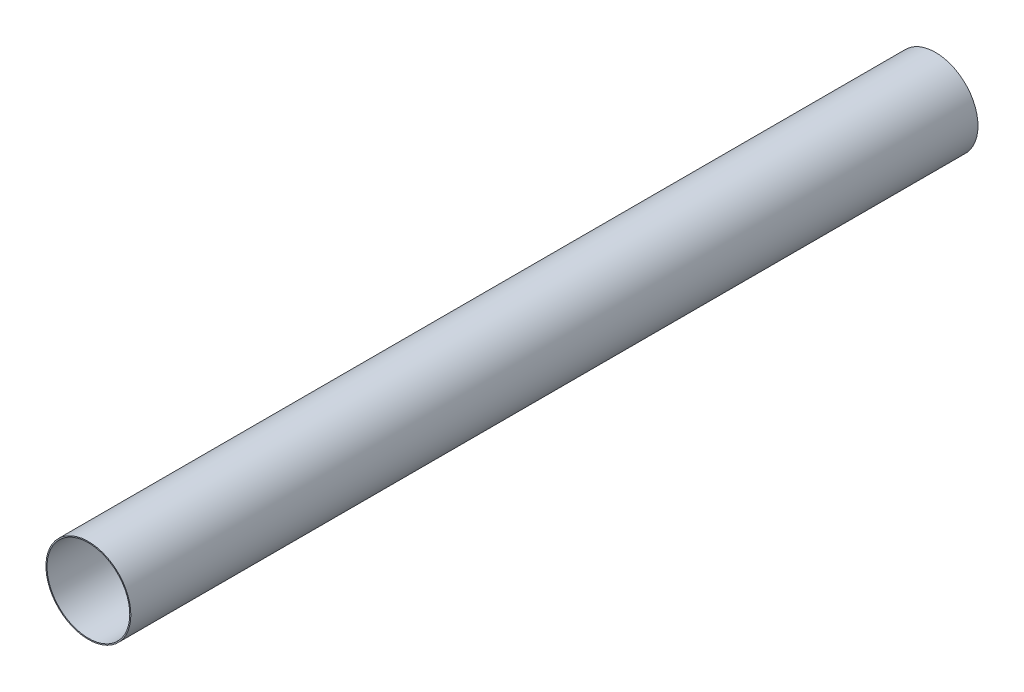
ISO-10303-21;
HEADER;
FILE_DESCRIPTION(('STEP AP214'),'2;1');
FILE_NAME('part.step','',(''),(''),'','','');
FILE_SCHEMA(('AUTOMOTIVE_DESIGN { 1 0 10303 214 1 1 1 1 }'));
ENDSEC;
DATA;
#1=APPLICATION_CONTEXT('core data for automotive mechanical design processes');
#2=APPLICATION_PROTOCOL_DEFINITION('international standard','automotive_design',2000,#1);
#3=PRODUCT_CONTEXT('',#1,'mechanical');
#4=PRODUCT('Part','Part','',(#3));
#5=PRODUCT_RELATED_PRODUCT_CATEGORY('part','',(#4));
#6=PRODUCT_DEFINITION_FORMATION('','',#4);
#7=PRODUCT_DEFINITION_CONTEXT('part definition',#1,'design');
#8=PRODUCT_DEFINITION('design','',#6,#7);
#9=PRODUCT_DEFINITION_SHAPE('','',#8);
#10=(LENGTH_UNIT() NAMED_UNIT(*) SI_UNIT(.MILLI.,.METRE.));
#11=(NAMED_UNIT(*) PLANE_ANGLE_UNIT() SI_UNIT($,.RADIAN.));
#12=(NAMED_UNIT(*) SI_UNIT($,.STERADIAN.) SOLID_ANGLE_UNIT());
#13=UNCERTAINTY_MEASURE_WITH_UNIT(LENGTH_MEASURE(1.E-05),#10,'distance_accuracy_value','');
#14=(GEOMETRIC_REPRESENTATION_CONTEXT(3) GLOBAL_UNCERTAINTY_ASSIGNED_CONTEXT((#13)) GLOBAL_UNIT_ASSIGNED_CONTEXT((#10,
#11,#12)) REPRESENTATION_CONTEXT('',''));
#15=CARTESIAN_POINT('',(0.,0.,0.));
#16=DIRECTION('',(0.,0.,1.));
#17=DIRECTION('',(1.,0.,0.));
#18=AXIS2_PLACEMENT_3D('',#15,#16,#17);
#19=CARTESIAN_POINT('',(0.,0.,1560.));
#20=DIRECTION('',(0.,0.,1.));
#21=DIRECTION('',(1.,0.,0.));
#22=AXIS2_PLACEMENT_3D('',#19,#20,#21);
#23=PLANE('',#22);
#24=CARTESIAN_POINT('',(0.,0.,1560.));
#25=DIRECTION('',(0.,0.,1.));
#26=DIRECTION('',(1.,0.,0.));
#27=AXIS2_PLACEMENT_3D('',#24,#25,#26);
#28=CIRCLE('',#27,78.2);
#29=CARTESIAN_POINT('',(78.2,0.,1560.));
#30=VERTEX_POINT('',#29);
#31=EDGE_CURVE('E10',#30,#30,#28,.T.);
#32=ORIENTED_EDGE('',*,*,#31,.T.);
#33=EDGE_LOOP('',(#32));
#34=FACE_BOUND('',#33,.T.);
#35=CARTESIAN_POINT('',(0.,0.,1560.));
#36=DIRECTION('',(0.,0.,1.));
#37=DIRECTION('',(1.,0.,0.));
#38=AXIS2_PLACEMENT_3D('',#35,#36,#37);
#39=CIRCLE('',#38,76.2);
#40=CARTESIAN_POINT('',(76.2,0.,1560.));
#41=VERTEX_POINT('',#40);
#42=EDGE_CURVE('E50',#41,#41,#39,.T.);
#43=ORIENTED_EDGE('',*,*,#42,.F.);
#44=EDGE_LOOP('',(#43));
#45=FACE_BOUND('',#44,.T.);
#46=ADVANCED_FACE('F37',(#34,#45),#23,.T.);
#47=CARTESIAN_POINT('',(0.,0.,0.));
#48=DIRECTION('',(0.,0.,1.));
#49=DIRECTION('',(1.,0.,0.));
#50=AXIS2_PLACEMENT_3D('',#47,#48,#49);
#51=PLANE('',#50);
#52=CARTESIAN_POINT('',(0.,0.,0.));
#53=DIRECTION('',(0.,0.,1.));
#54=DIRECTION('',(1.,0.,0.));
#55=AXIS2_PLACEMENT_3D('',#52,#53,#54);
#56=CIRCLE('',#55,78.2);
#57=CARTESIAN_POINT('',(78.2,0.,0.));
#58=VERTEX_POINT('',#57);
#59=EDGE_CURVE('E41',#58,#58,#56,.T.);
#60=ORIENTED_EDGE('',*,*,#59,.F.);
#61=EDGE_LOOP('',(#60));
#62=FACE_BOUND('',#61,.T.);
#63=CARTESIAN_POINT('',(0.,0.,0.));
#64=DIRECTION('',(0.,0.,1.));
#65=DIRECTION('',(1.,0.,0.));
#66=AXIS2_PLACEMENT_3D('',#63,#64,#65);
#67=CIRCLE('',#66,76.2);
#68=CARTESIAN_POINT('',(76.2,0.,0.));
#69=VERTEX_POINT('',#68);
#70=EDGE_CURVE('E52',#69,#69,#67,.T.);
#71=ORIENTED_EDGE('',*,*,#70,.T.);
#72=EDGE_LOOP('',(#71));
#73=FACE_BOUND('',#72,.T.);
#74=ADVANCED_FACE('F64',(#62,#73),#51,.F.);
#75=CARTESIAN_POINT('',(0.,0.,1560.));
#76=DIRECTION('',(0.,0.,-1.));
#77=DIRECTION('',(-1.,0.,0.));
#78=AXIS2_PLACEMENT_3D('',#75,#76,#77);
#79=CYLINDRICAL_SURFACE('',#78,78.2);
#80=ORIENTED_EDGE('',*,*,#31,.F.);
#81=EDGE_LOOP('',(#80));
#82=FACE_BOUND('',#81,.T.);
#83=ORIENTED_EDGE('',*,*,#59,.T.);
#84=EDGE_LOOP('',(#83));
#85=FACE_BOUND('',#84,.T.);
#86=ADVANCED_FACE('F39',(#82,#85),#79,.T.);
#87=CARTESIAN_POINT('',(0.,0.,1560.));
#88=DIRECTION('',(0.,0.,-1.));
#89=DIRECTION('',(-1.,0.,0.));
#90=AXIS2_PLACEMENT_3D('',#87,#88,#89);
#91=CYLINDRICAL_SURFACE('',#90,76.2);
#92=ORIENTED_EDGE('',*,*,#42,.T.);
#93=EDGE_LOOP('',(#92));
#94=FACE_BOUND('',#93,.T.);
#95=ORIENTED_EDGE('',*,*,#70,.F.);
#96=EDGE_LOOP('',(#95));
#97=FACE_BOUND('',#96,.T.);
#98=ADVANCED_FACE('F60',(#94,#97),#91,.F.);
#99=CLOSED_SHELL('',(#46,#74,#86,#98));
#100=MANIFOLD_SOLID_BREP('B2',#99);
#101=ADVANCED_BREP_SHAPE_REPRESENTATION('',(#18,#100),#14);
#102=SHAPE_DEFINITION_REPRESENTATION(#9,#101);
ENDSEC;
END-ISO-10303-21;
